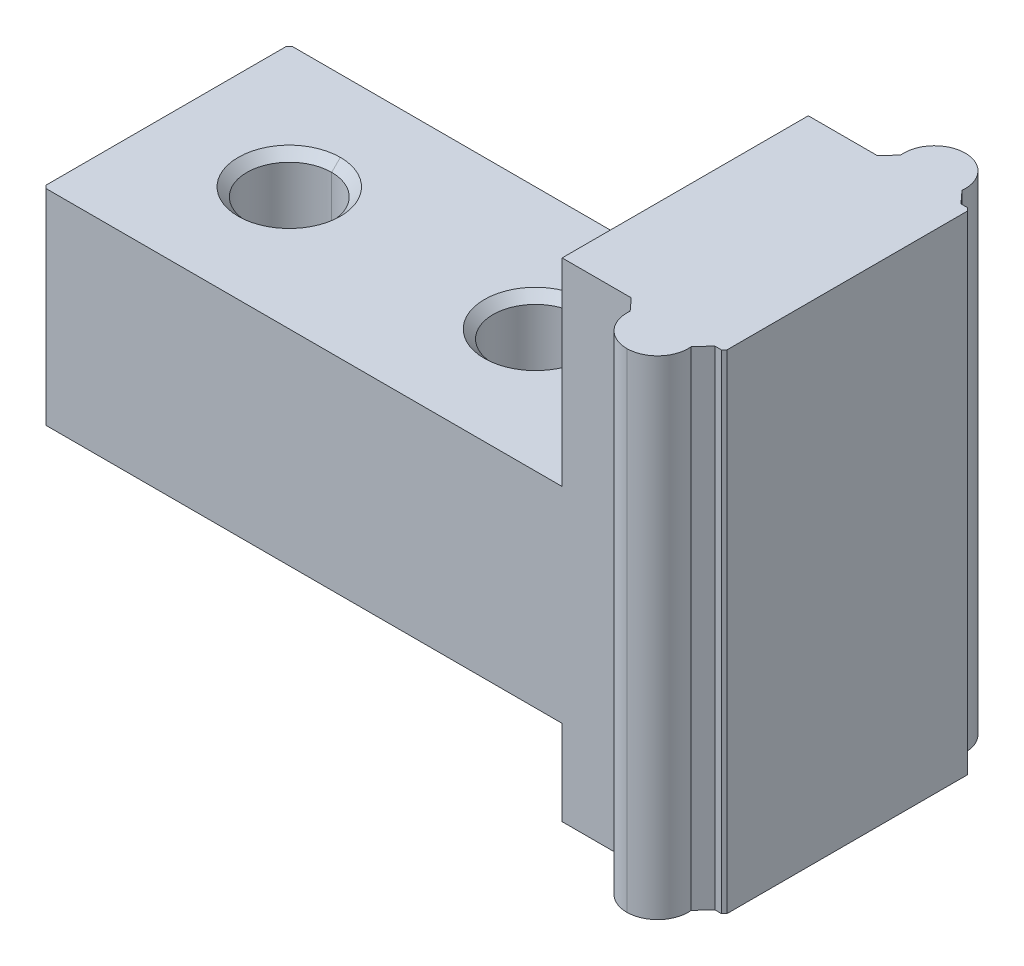
ISO-10303-21;
HEADER;
FILE_DESCRIPTION(('STEP AP214'),'2;1');
FILE_NAME('part.step','',(''),(''),'','','');
FILE_SCHEMA(('AUTOMOTIVE_DESIGN { 1 0 10303 214 1 1 1 1 }'));
ENDSEC;
DATA;
#1=APPLICATION_CONTEXT('core data for automotive mechanical design processes');
#2=APPLICATION_PROTOCOL_DEFINITION('international standard','automotive_design',2000,#1);
#3=PRODUCT_CONTEXT('',#1,'mechanical');
#4=PRODUCT('Part','Part','',(#3));
#5=PRODUCT_RELATED_PRODUCT_CATEGORY('part','',(#4));
#6=PRODUCT_DEFINITION_FORMATION('','',#4);
#7=PRODUCT_DEFINITION_CONTEXT('part definition',#1,'design');
#8=PRODUCT_DEFINITION('design','',#6,#7);
#9=PRODUCT_DEFINITION_SHAPE('','',#8);
#10=(LENGTH_UNIT() NAMED_UNIT(*) SI_UNIT(.MILLI.,.METRE.));
#11=(NAMED_UNIT(*) PLANE_ANGLE_UNIT() SI_UNIT($,.RADIAN.));
#12=(NAMED_UNIT(*) SI_UNIT($,.STERADIAN.) SOLID_ANGLE_UNIT());
#13=UNCERTAINTY_MEASURE_WITH_UNIT(LENGTH_MEASURE(1.E-05),#10,'distance_accuracy_value','');
#14=(GEOMETRIC_REPRESENTATION_CONTEXT(3) GLOBAL_UNCERTAINTY_ASSIGNED_CONTEXT((#13)) GLOBAL_UNIT_ASSIGNED_CONTEXT((#10,
#11,#12)) REPRESENTATION_CONTEXT('',''));
#15=CARTESIAN_POINT('',(0.,0.,0.));
#16=DIRECTION('',(0.,0.,1.));
#17=DIRECTION('',(1.,0.,0.));
#18=AXIS2_PLACEMENT_3D('',#15,#16,#17);
#19=CARTESIAN_POINT('',(-85.,-17.073,0.));
#20=DIRECTION('',(0.,1.,0.));
#21=DIRECTION('',(0.,0.,1.));
#22=AXIS2_PLACEMENT_3D('',#19,#20,#21);
#23=CONICAL_SURFACE('',#22,2.067,0.785398163397469);
#24=DIRECTION('',(0.,0.707106781186533,-0.707106781186562));
#25=VECTOR('',#24,1.);
#26=CARTESIAN_POINT('',(-85.,-17.073,-2.067));
#27=LINE('',#26,#25);
#28=CARTESIAN_POINT('',(-85.,-17.073,-2.067));
#29=VERTEX_POINT('',#28);
#30=CARTESIAN_POINT('',(-85.,-16.65,-2.49));
#31=VERTEX_POINT('',#30);
#32=EDGE_CURVE('E477',#29,#31,#27,.T.);
#33=ORIENTED_EDGE('',*,*,#32,.F.);
#34=CARTESIAN_POINT('',(-85.,-17.073,0.));
#35=DIRECTION('',(0.,1.,0.));
#36=DIRECTION('',(0.,0.,1.));
#37=AXIS2_PLACEMENT_3D('',#34,#35,#36);
#38=CIRCLE('',#37,2.067);
#39=CARTESIAN_POINT('',(-85.,-17.073,2.067));
#40=VERTEX_POINT('',#39);
#41=EDGE_CURVE('E11',#40,#29,#38,.T.);
#42=ORIENTED_EDGE('',*,*,#41,.F.);
#43=DIRECTION('',(0.,0.707106781186533,0.707106781186562));
#44=VECTOR('',#43,1.);
#45=CARTESIAN_POINT('',(-85.,-17.073,2.067));
#46=LINE('',#45,#44);
#47=CARTESIAN_POINT('',(-85.,-16.65,2.49));
#48=VERTEX_POINT('',#47);
#49=EDGE_CURVE('E471',#40,#48,#46,.T.);
#50=ORIENTED_EDGE('',*,*,#49,.T.);
#51=CARTESIAN_POINT('',(-85.,-16.65,0.));
#52=DIRECTION('',(0.,-1.,0.));
#53=DIRECTION('',(0.,0.,1.));
#54=AXIS2_PLACEMENT_3D('',#51,#52,#53);
#55=CIRCLE('',#54,2.49);
#56=EDGE_CURVE('E352',#31,#48,#55,.T.);
#57=ORIENTED_EDGE('',*,*,#56,.F.);
#58=EDGE_LOOP('',(#33,#42,#50,#57));
#59=FACE_BOUND('',#58,.T.);
#60=ADVANCED_FACE('F17',(#59),#23,.F.);
#61=CARTESIAN_POINT('',(-85.,-16.64,0.));
#62=DIRECTION('',(0.,1.,0.));
#63=DIRECTION('',(0.,0.,1.));
#64=AXIS2_PLACEMENT_3D('',#61,#62,#63);
#65=CYLINDRICAL_SURFACE('',#64,2.067);
#66=DIRECTION('',(0.,1.,0.));
#67=VECTOR('',#66,1.);
#68=CARTESIAN_POINT('',(-85.,-16.64,-2.067));
#69=LINE('',#68,#67);
#70=CARTESIAN_POINT('',(-85.,-26.217,-2.067));
#71=VERTEX_POINT('',#70);
#72=EDGE_CURVE('E485',#71,#29,#69,.T.);
#73=ORIENTED_EDGE('',*,*,#72,.F.);
#74=CARTESIAN_POINT('',(-85.,-26.217,0.));
#75=DIRECTION('',(0.,1.,0.));
#76=DIRECTION('',(0.,0.,1.));
#77=AXIS2_PLACEMENT_3D('',#74,#75,#76);
#78=CIRCLE('',#77,2.067);
#79=CARTESIAN_POINT('',(-85.,-26.217,2.067));
#80=VERTEX_POINT('',#79);
#81=EDGE_CURVE('E27',#80,#71,#78,.T.);
#82=ORIENTED_EDGE('',*,*,#81,.F.);
#83=DIRECTION('',(0.,1.,0.));
#84=VECTOR('',#83,1.);
#85=CARTESIAN_POINT('',(-85.,-16.64,2.067));
#86=LINE('',#85,#84);
#87=EDGE_CURVE('E495',#80,#40,#86,.T.);
#88=ORIENTED_EDGE('',*,*,#87,.T.);
#89=ORIENTED_EDGE('',*,*,#41,.T.);
#90=EDGE_LOOP('',(#73,#82,#88,#89));
#91=FACE_BOUND('',#90,.T.);
#92=ADVANCED_FACE('F19',(#91),#65,.F.);
#93=CARTESIAN_POINT('',(-85.,-26.65,0.));
#94=DIRECTION('',(0.,-1.,0.));
#95=DIRECTION('',(0.,0.,-1.));
#96=AXIS2_PLACEMENT_3D('',#93,#94,#95);
#97=CONICAL_SURFACE('',#96,2.5,0.785398163397469);
#98=DIRECTION('',(0.,-0.707106781186533,0.707106781186562));
#99=VECTOR('',#98,1.);
#100=CARTESIAN_POINT('',(-85.,-26.65,2.5));
#101=LINE('',#100,#99);
#102=CARTESIAN_POINT('',(-85.,-26.65,2.5));
#103=VERTEX_POINT('',#102);
#104=EDGE_CURVE('E499',#80,#103,#101,.T.);
#105=ORIENTED_EDGE('',*,*,#104,.F.);
#106=ORIENTED_EDGE('',*,*,#81,.T.);
#107=DIRECTION('',(0.,-0.707106781186533,-0.707106781186562));
#108=VECTOR('',#107,1.);
#109=CARTESIAN_POINT('',(-85.,-26.65,-2.5));
#110=LINE('',#109,#108);
#111=CARTESIAN_POINT('',(-85.,-26.65,-2.5));
#112=VERTEX_POINT('',#111);
#113=EDGE_CURVE('E466',#71,#112,#110,.T.);
#114=ORIENTED_EDGE('',*,*,#113,.T.);
#115=CARTESIAN_POINT('',(-85.,-26.65,0.));
#116=DIRECTION('',(0.,1.,0.));
#117=DIRECTION('',(0.,0.,1.));
#118=AXIS2_PLACEMENT_3D('',#115,#116,#117);
#119=CIRCLE('',#118,2.5);
#120=EDGE_CURVE('E353',#103,#112,#119,.T.);
#121=ORIENTED_EDGE('',*,*,#120,.F.);
#122=EDGE_LOOP('',(#105,#106,#114,#121));
#123=FACE_BOUND('',#122,.T.);
#124=ADVANCED_FACE('F962',(#123),#97,.F.);
#125=CARTESIAN_POINT('',(-97.,-17.073,0.));
#126=DIRECTION('',(0.,1.,0.));
#127=DIRECTION('',(0.,0.,1.));
#128=AXIS2_PLACEMENT_3D('',#125,#126,#127);
#129=CONICAL_SURFACE('',#128,2.067,0.785398163397469);
#130=DIRECTION('',(0.,0.707106781186533,-0.707106781186562));
#131=VECTOR('',#130,1.);
#132=CARTESIAN_POINT('',(-97.,-17.073,-2.067));
#133=LINE('',#132,#131);
#134=CARTESIAN_POINT('',(-97.,-17.073,-2.067));
#135=VERTEX_POINT('',#134);
#136=CARTESIAN_POINT('',(-97.,-16.65,-2.49));
#137=VERTEX_POINT('',#136);
#138=EDGE_CURVE('E520',#135,#137,#133,.T.);
#139=ORIENTED_EDGE('',*,*,#138,.F.);
#140=CARTESIAN_POINT('',(-97.,-17.073,0.));
#141=DIRECTION('',(0.,1.,0.));
#142=DIRECTION('',(0.,0.,1.));
#143=AXIS2_PLACEMENT_3D('',#140,#141,#142);
#144=CIRCLE('',#143,2.067);
#145=CARTESIAN_POINT('',(-97.,-17.073,2.067));
#146=VERTEX_POINT('',#145);
#147=EDGE_CURVE('E452',#146,#135,#144,.T.);
#148=ORIENTED_EDGE('',*,*,#147,.F.);
#149=DIRECTION('',(0.,0.707106781186533,0.707106781186562));
#150=VECTOR('',#149,1.);
#151=CARTESIAN_POINT('',(-97.,-17.073,2.067));
#152=LINE('',#151,#150);
#153=CARTESIAN_POINT('',(-97.,-16.65,2.49));
#154=VERTEX_POINT('',#153);
#155=EDGE_CURVE('E505',#146,#154,#152,.T.);
#156=ORIENTED_EDGE('',*,*,#155,.T.);
#157=CARTESIAN_POINT('',(-97.,-16.65,0.));
#158=DIRECTION('',(0.,-1.,0.));
#159=DIRECTION('',(0.,0.,1.));
#160=AXIS2_PLACEMENT_3D('',#157,#158,#159);
#161=CIRCLE('',#160,2.49);
#162=EDGE_CURVE('E432',#137,#154,#161,.T.);
#163=ORIENTED_EDGE('',*,*,#162,.F.);
#164=EDGE_LOOP('',(#139,#148,#156,#163));
#165=FACE_BOUND('',#164,.T.);
#166=ADVANCED_FACE('F540',(#165),#129,.F.);
#167=CARTESIAN_POINT('',(-97.,-16.64,0.));
#168=DIRECTION('',(0.,1.,0.));
#169=DIRECTION('',(0.,0.,1.));
#170=AXIS2_PLACEMENT_3D('',#167,#168,#169);
#171=CYLINDRICAL_SURFACE('',#170,2.067);
#172=DIRECTION('',(0.,1.,0.));
#173=VECTOR('',#172,1.);
#174=CARTESIAN_POINT('',(-97.,-16.64,-2.067));
#175=LINE('',#174,#173);
#176=CARTESIAN_POINT('',(-97.,-26.217,-2.067));
#177=VERTEX_POINT('',#176);
#178=EDGE_CURVE('E504',#177,#135,#175,.T.);
#179=ORIENTED_EDGE('',*,*,#178,.F.);
#180=CARTESIAN_POINT('',(-97.,-26.217,0.));
#181=DIRECTION('',(0.,1.,0.));
#182=DIRECTION('',(0.,0.,1.));
#183=AXIS2_PLACEMENT_3D('',#180,#181,#182);
#184=CIRCLE('',#183,2.067);
#185=CARTESIAN_POINT('',(-97.,-26.217,2.067));
#186=VERTEX_POINT('',#185);
#187=EDGE_CURVE('E442',#186,#177,#184,.T.);
#188=ORIENTED_EDGE('',*,*,#187,.F.);
#189=DIRECTION('',(0.,1.,0.));
#190=VECTOR('',#189,1.);
#191=CARTESIAN_POINT('',(-97.,-16.64,2.067));
#192=LINE('',#191,#190);
#193=EDGE_CURVE('E207',#186,#146,#192,.T.);
#194=ORIENTED_EDGE('',*,*,#193,.T.);
#195=ORIENTED_EDGE('',*,*,#147,.T.);
#196=EDGE_LOOP('',(#179,#188,#194,#195));
#197=FACE_BOUND('',#196,.T.);
#198=ADVANCED_FACE('F690',(#197),#171,.F.);
#199=CARTESIAN_POINT('',(-97.,-26.65,0.));
#200=DIRECTION('',(0.,-1.,0.));
#201=DIRECTION('',(0.,0.,-1.));
#202=AXIS2_PLACEMENT_3D('',#199,#200,#201);
#203=CONICAL_SURFACE('',#202,2.5,0.785398163397469);
#204=DIRECTION('',(0.,-0.707106781186533,0.707106781186562));
#205=VECTOR('',#204,1.);
#206=CARTESIAN_POINT('',(-97.,-26.65,2.5));
#207=LINE('',#206,#205);
#208=CARTESIAN_POINT('',(-97.,-26.65,2.5));
#209=VERTEX_POINT('',#208);
#210=EDGE_CURVE('E210',#186,#209,#207,.T.);
#211=ORIENTED_EDGE('',*,*,#210,.F.);
#212=ORIENTED_EDGE('',*,*,#187,.T.);
#213=DIRECTION('',(0.,-0.707106781186533,-0.707106781186562));
#214=VECTOR('',#213,1.);
#215=CARTESIAN_POINT('',(-97.,-26.65,-2.5));
#216=LINE('',#215,#214);
#217=CARTESIAN_POINT('',(-97.,-26.65,-2.5));
#218=VERTEX_POINT('',#217);
#219=EDGE_CURVE('E218',#177,#218,#216,.T.);
#220=ORIENTED_EDGE('',*,*,#219,.T.);
#221=CARTESIAN_POINT('',(-97.,-26.65,0.));
#222=DIRECTION('',(0.,1.,0.));
#223=DIRECTION('',(0.,0.,1.));
#224=AXIS2_PLACEMENT_3D('',#221,#222,#223);
#225=CIRCLE('',#224,2.5);
#226=EDGE_CURVE('E348',#209,#218,#225,.T.);
#227=ORIENTED_EDGE('',*,*,#226,.F.);
#228=EDGE_LOOP('',(#211,#212,#220,#227));
#229=FACE_BOUND('',#228,.T.);
#230=ADVANCED_FACE('F975',(#229),#203,.F.);
#231=CARTESIAN_POINT('',(0.,-16.65,0.));
#232=DIRECTION('',(0.,1.,0.));
#233=DIRECTION('',(1.,0.,0.));
#234=AXIS2_PLACEMENT_3D('',#231,#232,#233);
#235=PLANE('',#234);
#236=CARTESIAN_POINT('',(-97.,-16.65,0.));
#237=DIRECTION('',(0.,-1.,0.));
#238=DIRECTION('',(0.,0.,1.));
#239=AXIS2_PLACEMENT_3D('',#236,#237,#238);
#240=CIRCLE('',#239,2.49);
#241=EDGE_CURVE('E524',#154,#137,#240,.T.);
#242=ORIENTED_EDGE('',*,*,#241,.T.);
#243=ORIENTED_EDGE('',*,*,#162,.T.);
#244=EDGE_LOOP('',(#242,#243));
#245=FACE_BOUND('',#244,.T.);
#246=CARTESIAN_POINT('',(-85.,-16.65,0.));
#247=DIRECTION('',(0.,-1.,0.));
#248=DIRECTION('',(0.,0.,1.));
#249=AXIS2_PLACEMENT_3D('',#246,#247,#248);
#250=CIRCLE('',#249,2.49);
#251=EDGE_CURVE('E476',#48,#31,#250,.T.);
#252=ORIENTED_EDGE('',*,*,#251,.T.);
#253=ORIENTED_EDGE('',*,*,#56,.T.);
#254=EDGE_LOOP('',(#252,#253));
#255=FACE_BOUND('',#254,.T.);
#256=DIRECTION('',(1.,0.,0.));
#257=VECTOR('',#256,1.);
#258=CARTESIAN_POINT('',(-102.85857864376,-16.65,6.));
#259=LINE('',#258,#257);
#260=CARTESIAN_POINT('',(-102.85857864376,-16.65,6.));
#261=VERTEX_POINT('',#260);
#262=CARTESIAN_POINT('',(-77.7,-16.65,6.));
#263=VERTEX_POINT('',#262);
#264=EDGE_CURVE('E328',#261,#263,#259,.T.);
#265=ORIENTED_EDGE('',*,*,#264,.T.);
#266=DIRECTION('',(0.,0.,-1.));
#267=VECTOR('',#266,1.);
#268=CARTESIAN_POINT('',(-77.7,-16.65,6.));
#269=LINE('',#268,#267);
#270=CARTESIAN_POINT('',(-77.7,-16.65,-6.));
#271=VERTEX_POINT('',#270);
#272=EDGE_CURVE('E312',#263,#271,#269,.T.);
#273=ORIENTED_EDGE('',*,*,#272,.T.);
#274=DIRECTION('',(-1.,0.,0.));
#275=VECTOR('',#274,1.);
#276=CARTESIAN_POINT('',(-77.7,-16.65,-6.));
#277=LINE('',#276,#275);
#278=CARTESIAN_POINT('',(-102.85857864376,-16.65,-6.));
#279=VERTEX_POINT('',#278);
#280=EDGE_CURVE('E231',#271,#279,#277,.T.);
#281=ORIENTED_EDGE('',*,*,#280,.T.);
#282=DIRECTION('',(-0.707106781193316,0.,0.70710678117978));
#283=VECTOR('',#282,1.);
#284=CARTESIAN_POINT('',(-102.85857864376,-16.65,-6.));
#285=LINE('',#284,#283);
#286=CARTESIAN_POINT('',(-103.,-16.65,-5.8585786437627));
#287=VERTEX_POINT('',#286);
#288=EDGE_CURVE('E198',#279,#287,#285,.T.);
#289=ORIENTED_EDGE('',*,*,#288,.T.);
#290=DIRECTION('',(0.,0.,1.));
#291=VECTOR('',#290,1.);
#292=CARTESIAN_POINT('',(-103.,-16.65,-5.8585786437627));
#293=LINE('',#292,#291);
#294=CARTESIAN_POINT('',(-103.,-16.65,5.8585786437627));
#295=VERTEX_POINT('',#294);
#296=EDGE_CURVE('E172',#287,#295,#293,.T.);
#297=ORIENTED_EDGE('',*,*,#296,.T.);
#298=DIRECTION('',(0.707106781193316,0.,0.70710678117978));
#299=VECTOR('',#298,1.);
#300=CARTESIAN_POINT('',(-103.,-16.65,5.8585786437627));
#301=LINE('',#300,#299);
#302=EDGE_CURVE('E356',#295,#261,#301,.T.);
#303=ORIENTED_EDGE('',*,*,#302,.T.);
#304=EDGE_LOOP('',(#265,#273,#281,#289,#297,#303));
#305=FACE_BOUND('',#304,.T.);
#306=ADVANCED_FACE('F549',(#245,#255,#305),#235,.T.);
#307=CARTESIAN_POINT('',(0.,-26.65,0.));
#308=DIRECTION('',(0.,1.,0.));
#309=DIRECTION('',(1.,0.,0.));
#310=AXIS2_PLACEMENT_3D('',#307,#308,#309);
#311=PLANE('',#310);
#312=CARTESIAN_POINT('',(-97.,-26.65,0.));
#313=DIRECTION('',(0.,1.,0.));
#314=DIRECTION('',(0.,0.,1.));
#315=AXIS2_PLACEMENT_3D('',#312,#313,#314);
#316=CIRCLE('',#315,2.5);
#317=EDGE_CURVE('E214',#218,#209,#316,.T.);
#318=ORIENTED_EDGE('',*,*,#317,.T.);
#319=ORIENTED_EDGE('',*,*,#226,.T.);
#320=EDGE_LOOP('',(#318,#319));
#321=FACE_BOUND('',#320,.T.);
#322=CARTESIAN_POINT('',(-85.,-26.65,0.));
#323=DIRECTION('',(0.,1.,0.));
#324=DIRECTION('',(0.,0.,1.));
#325=AXIS2_PLACEMENT_3D('',#322,#323,#324);
#326=CIRCLE('',#325,2.5);
#327=EDGE_CURVE('E512',#112,#103,#326,.T.);
#328=ORIENTED_EDGE('',*,*,#327,.T.);
#329=ORIENTED_EDGE('',*,*,#120,.T.);
#330=EDGE_LOOP('',(#328,#329));
#331=FACE_BOUND('',#330,.T.);
#332=DIRECTION('',(0.,0.,-1.));
#333=VECTOR('',#332,1.);
#334=CARTESIAN_POINT('',(-77.7,-26.65,6.));
#335=LINE('',#334,#333);
#336=CARTESIAN_POINT('',(-77.7,-26.65,6.));
#337=VERTEX_POINT('',#336);
#338=CARTESIAN_POINT('',(-77.7,-26.65,-6.));
#339=VERTEX_POINT('',#338);
#340=EDGE_CURVE('E266',#337,#339,#335,.T.);
#341=ORIENTED_EDGE('',*,*,#340,.F.);
#342=DIRECTION('',(1.,0.,0.));
#343=VECTOR('',#342,1.);
#344=CARTESIAN_POINT('',(-102.85857864376,-26.65,6.));
#345=LINE('',#344,#343);
#346=CARTESIAN_POINT('',(-102.85857864376,-26.65,6.));
#347=VERTEX_POINT('',#346);
#348=EDGE_CURVE('E336',#347,#337,#345,.T.);
#349=ORIENTED_EDGE('',*,*,#348,.F.);
#350=DIRECTION('',(0.707106781193316,0.,0.70710678117978));
#351=VECTOR('',#350,1.);
#352=CARTESIAN_POINT('',(-103.,-26.65,5.8585786437627));
#353=LINE('',#352,#351);
#354=CARTESIAN_POINT('',(-103.,-26.65,5.8585786437627));
#355=VERTEX_POINT('',#354);
#356=EDGE_CURVE('E41',#355,#347,#353,.T.);
#357=ORIENTED_EDGE('',*,*,#356,.F.);
#358=DIRECTION('',(0.,0.,1.));
#359=VECTOR('',#358,1.);
#360=CARTESIAN_POINT('',(-103.,-26.65,-5.8585786437627));
#361=LINE('',#360,#359);
#362=CARTESIAN_POINT('',(-103.,-26.65,-5.8585786437627));
#363=VERTEX_POINT('',#362);
#364=EDGE_CURVE('E178',#363,#355,#361,.T.);
#365=ORIENTED_EDGE('',*,*,#364,.F.);
#366=DIRECTION('',(-0.707106781193316,0.,0.70710678117978));
#367=VECTOR('',#366,1.);
#368=CARTESIAN_POINT('',(-102.85857864376,-26.65,-6.));
#369=LINE('',#368,#367);
#370=CARTESIAN_POINT('',(-102.85857864376,-26.65,-6.));
#371=VERTEX_POINT('',#370);
#372=EDGE_CURVE('E182',#371,#363,#369,.T.);
#373=ORIENTED_EDGE('',*,*,#372,.F.);
#374=DIRECTION('',(-1.,0.,0.));
#375=VECTOR('',#374,1.);
#376=CARTESIAN_POINT('',(-77.7,-26.65,-6.));
#377=LINE('',#376,#375);
#378=EDGE_CURVE('E232',#339,#371,#377,.T.);
#379=ORIENTED_EDGE('',*,*,#378,.F.);
#380=EDGE_LOOP('',(#341,#349,#357,#365,#373,#379));
#381=FACE_BOUND('',#380,.T.);
#382=ADVANCED_FACE('F180',(#321,#331,#381),#311,.F.);
#383=CARTESIAN_POINT('',(-103.,-26.65,5.8585786437627));
#384=DIRECTION('',(-0.707106781179767,0.,0.707106781193328));
#385=DIRECTION('',(0.,1.,0.));
#386=AXIS2_PLACEMENT_3D('',#383,#384,#385);
#387=PLANE('',#386);
#388=ORIENTED_EDGE('',*,*,#302,.F.);
#389=DIRECTION('',(0.,1.,0.));
#390=VECTOR('',#389,1.);
#391=CARTESIAN_POINT('',(-103.,-26.65,5.8585786437627));
#392=LINE('',#391,#390);
#393=EDGE_CURVE('E185',#355,#295,#392,.T.);
#394=ORIENTED_EDGE('',*,*,#393,.F.);
#395=ORIENTED_EDGE('',*,*,#356,.T.);
#396=DIRECTION('',(0.,1.,0.));
#397=VECTOR('',#396,1.);
#398=CARTESIAN_POINT('',(-102.85857864376,-26.65,6.));
#399=LINE('',#398,#397);
#400=EDGE_CURVE('E332',#347,#261,#399,.T.);
#401=ORIENTED_EDGE('',*,*,#400,.T.);
#402=EDGE_LOOP('',(#388,#394,#395,#401));
#403=FACE_BOUND('',#402,.T.);
#404=ADVANCED_FACE('F1005',(#403),#387,.T.);
#405=CARTESIAN_POINT('',(-103.,-26.65,-5.8585786437627));
#406=DIRECTION('',(-1.,0.,0.));
#407=DIRECTION('',(0.,0.,1.));
#408=AXIS2_PLACEMENT_3D('',#405,#406,#407);
#409=PLANE('',#408);
#410=ORIENTED_EDGE('',*,*,#296,.F.);
#411=DIRECTION('',(0.,1.,0.));
#412=VECTOR('',#411,1.);
#413=CARTESIAN_POINT('',(-103.,-26.65,-5.8585786437627));
#414=LINE('',#413,#412);
#415=EDGE_CURVE('E187',#363,#287,#414,.T.);
#416=ORIENTED_EDGE('',*,*,#415,.F.);
#417=ORIENTED_EDGE('',*,*,#364,.T.);
#418=ORIENTED_EDGE('',*,*,#393,.T.);
#419=EDGE_LOOP('',(#410,#416,#417,#418));
#420=FACE_BOUND('',#419,.T.);
#421=ADVANCED_FACE('F188',(#420),#409,.T.);
#422=CARTESIAN_POINT('',(-102.85857864376,-26.65,-6.));
#423=DIRECTION('',(-0.707106781179767,0.,-0.707106781193328));
#424=DIRECTION('',(-0.707106781193328,0.,0.707106781179767));
#425=AXIS2_PLACEMENT_3D('',#422,#423,#424);
#426=PLANE('',#425);
#427=ORIENTED_EDGE('',*,*,#288,.F.);
#428=DIRECTION('',(0.,1.,0.));
#429=VECTOR('',#428,1.);
#430=CARTESIAN_POINT('',(-102.85857864376,-26.65,-6.));
#431=LINE('',#430,#429);
#432=EDGE_CURVE('E195',#371,#279,#431,.T.);
#433=ORIENTED_EDGE('',*,*,#432,.F.);
#434=ORIENTED_EDGE('',*,*,#372,.T.);
#435=ORIENTED_EDGE('',*,*,#415,.T.);
#436=EDGE_LOOP('',(#427,#433,#434,#435));
#437=FACE_BOUND('',#436,.T.);
#438=ADVANCED_FACE('F193',(#437),#426,.T.);
#439=CARTESIAN_POINT('',(-72.3,-7.,6.75000000000043));
#440=DIRECTION('',(0.,1.,0.));
#441=DIRECTION('',(1.,0.,0.));
#442=AXIS2_PLACEMENT_3D('',#439,#440,#441);
#443=PLANE('',#442);
#444=DIRECTION('',(-1.,0.,0.));
#445=VECTOR('',#444,1.);
#446=CARTESIAN_POINT('',(-74.33,-7.,-6.));
#447=LINE('',#446,#445);
#448=CARTESIAN_POINT('',(-74.33,-7.,-6.));
#449=VERTEX_POINT('',#448);
#450=CARTESIAN_POINT('',(-77.7,-7.,-6.));
#451=VERTEX_POINT('',#450);
#452=EDGE_CURVE('E299',#449,#451,#447,.T.);
#453=ORIENTED_EDGE('',*,*,#452,.T.);
#454=DIRECTION('',(0.,0.,1.));
#455=VECTOR('',#454,1.);
#456=CARTESIAN_POINT('',(-77.7,-7.,-6.));
#457=LINE('',#456,#455);
#458=CARTESIAN_POINT('',(-77.7,-7.,6.));
#459=VERTEX_POINT('',#458);
#460=EDGE_CURVE('E321',#451,#459,#457,.T.);
#461=ORIENTED_EDGE('',*,*,#460,.T.);
#462=DIRECTION('',(1.,0.,0.));
#463=VECTOR('',#462,1.);
#464=CARTESIAN_POINT('',(-77.7,-7.,6.));
#465=LINE('',#464,#463);
#466=CARTESIAN_POINT('',(-74.33,-7.,6.));
#467=VERTEX_POINT('',#466);
#468=EDGE_CURVE('E347',#459,#467,#465,.T.);
#469=ORIENTED_EDGE('',*,*,#468,.T.);
#470=DIRECTION('',(0.671737143893339,0.,0.740789585181933));
#471=VECTOR('',#470,1.);
#472=CARTESIAN_POINT('',(-74.33,-7.,6.));
#473=LINE('',#472,#471);
#474=CARTESIAN_POINT('',(-73.79181454356,-7.,6.5935092091475));
#475=VERTEX_POINT('',#474);
#476=EDGE_CURVE('E364',#467,#475,#473,.T.);
#477=ORIENTED_EDGE('',*,*,#476,.T.);
#478=CARTESIAN_POINT('',(-72.3,-7.,6.75000000000043));
#479=DIRECTION('',(0.,1.,0.));
#480=DIRECTION('',(-0.994543029040242,0.,-0.104327193901979));
#481=AXIS2_PLACEMENT_3D('',#478,#479,#480);
#482=CIRCLE('',#481,1.49999999999959);
#483=CARTESIAN_POINT('',(-72.3,-7.,8.25));
#484=VERTEX_POINT('',#483);
#485=EDGE_CURVE('E245',#475,#484,#482,.T.);
#486=ORIENTED_EDGE('',*,*,#485,.T.);
#487=CARTESIAN_POINT('',(-72.3,-7.,6.75000000000043));
#488=DIRECTION('',(0.,1.,0.));
#489=DIRECTION('',(-0.994543029040242,0.,-0.104327193901979));
#490=AXIS2_PLACEMENT_3D('',#487,#488,#489);
#491=CIRCLE('',#490,1.49999999999959);
#492=CARTESIAN_POINT('',(-70.807595149903,-7.,6.5992427003244));
#493=VERTEX_POINT('',#492);
#494=EDGE_CURVE('E386',#484,#493,#491,.T.);
#495=ORIENTED_EDGE('',*,*,#494,.T.);
#496=DIRECTION('',(0.674578687870797,0.,-0.7382029489717));
#497=VECTOR('',#496,1.);
#498=CARTESIAN_POINT('',(-70.807595149903,-7.,6.5992427003244));
#499=LINE('',#498,#497);
#500=CARTESIAN_POINT('',(-70.26,-7.,6.));
#501=VERTEX_POINT('',#500);
#502=EDGE_CURVE('E390',#493,#501,#499,.T.);
#503=ORIENTED_EDGE('',*,*,#502,.T.);
#504=DIRECTION('',(1.,0.,0.));
#505=VECTOR('',#504,1.);
#506=CARTESIAN_POINT('',(-70.26,-7.,6.));
#507=LINE('',#506,#505);
#508=CARTESIAN_POINT('',(-69.941421356237,-7.,6.));
#509=VERTEX_POINT('',#508);
#510=EDGE_CURVE('E251',#501,#509,#507,.T.);
#511=ORIENTED_EDGE('',*,*,#510,.T.);
#512=DIRECTION('',(0.707106781185801,0.,-0.707106781187294));
#513=VECTOR('',#512,1.);
#514=CARTESIAN_POINT('',(-69.941421356237,-7.,6.));
#515=LINE('',#514,#513);
#516=CARTESIAN_POINT('',(-69.8,-7.,5.8585786437627));
#517=VERTEX_POINT('',#516);
#518=EDGE_CURVE('E265',#509,#517,#515,.T.);
#519=ORIENTED_EDGE('',*,*,#518,.T.);
#520=DIRECTION('',(0.,0.,-1.));
#521=VECTOR('',#520,1.);
#522=CARTESIAN_POINT('',(-69.8,-7.,5.8585786437627));
#523=LINE('',#522,#521);
#524=CARTESIAN_POINT('',(-69.8,-7.,-5.8585786437627));
#525=VERTEX_POINT('',#524);
#526=EDGE_CURVE('E395',#517,#525,#523,.T.);
#527=ORIENTED_EDGE('',*,*,#526,.T.);
#528=DIRECTION('',(-0.707106781185801,0.,-0.707106781187294));
#529=VECTOR('',#528,1.);
#530=CARTESIAN_POINT('',(-69.8,-7.,-5.8585786437627));
#531=LINE('',#530,#529);
#532=CARTESIAN_POINT('',(-69.941421356237,-7.,-6.));
#533=VERTEX_POINT('',#532);
#534=EDGE_CURVE('E237',#525,#533,#531,.T.);
#535=ORIENTED_EDGE('',*,*,#534,.T.);
#536=DIRECTION('',(-1.,0.,0.));
#537=VECTOR('',#536,1.);
#538=CARTESIAN_POINT('',(-69.941421356237,-7.,-6.));
#539=LINE('',#538,#537);
#540=CARTESIAN_POINT('',(-70.26,-7.,-6.));
#541=VERTEX_POINT('',#540);
#542=EDGE_CURVE('E227',#533,#541,#539,.T.);
#543=ORIENTED_EDGE('',*,*,#542,.T.);
#544=DIRECTION('',(-0.674578687870797,0.,-0.7382029489717));
#545=VECTOR('',#544,1.);
#546=CARTESIAN_POINT('',(-70.26,-7.,-6.));
#547=LINE('',#546,#545);
#548=CARTESIAN_POINT('',(-70.807595149903,-7.,-6.5992427003244));
#549=VERTEX_POINT('',#548);
#550=EDGE_CURVE('E289',#541,#549,#547,.T.);
#551=ORIENTED_EDGE('',*,*,#550,.T.);
#552=CARTESIAN_POINT('',(-72.3,-7.,-6.75000000000043));
#553=DIRECTION('',(0.,1.,0.));
#554=DIRECTION('',(0.99493656673163,0.,0.100504866450717));
#555=AXIS2_PLACEMENT_3D('',#552,#553,#554);
#556=CIRCLE('',#555,1.4999999999996);
#557=CARTESIAN_POINT('',(-73.79181454356,-7.,-6.5935092091475));
#558=VERTEX_POINT('',#557);
#559=EDGE_CURVE('E316',#549,#558,#556,.T.);
#560=ORIENTED_EDGE('',*,*,#559,.T.);
#561=DIRECTION('',(-0.67173714389334,0.,0.740789585181932));
#562=VECTOR('',#561,1.);
#563=CARTESIAN_POINT('',(-73.79181454356,-7.,-6.5935092091475));
#564=LINE('',#563,#562);
#565=EDGE_CURVE('E271',#558,#449,#564,.T.);
#566=ORIENTED_EDGE('',*,*,#565,.T.);
#567=EDGE_LOOP('',(#453,#461,#469,#477,#486,#495,#503,#511,#519,#527,#535,#543,#551,#560,#566));
#568=FACE_BOUND('',#567,.T.);
#569=ADVANCED_FACE('F652',(#568),#443,.T.);
#570=CARTESIAN_POINT('',(-72.3,-30.8,6.75000000000043));
#571=DIRECTION('',(0.,1.,0.));
#572=DIRECTION('',(1.,0.,0.));
#573=AXIS2_PLACEMENT_3D('',#570,#571,#572);
#574=PLANE('',#573);
#575=DIRECTION('',(-1.,0.,0.));
#576=VECTOR('',#575,1.);
#577=CARTESIAN_POINT('',(-74.33,-30.8,-6.));
#578=LINE('',#577,#576);
#579=CARTESIAN_POINT('',(-74.33,-30.8,-6.));
#580=VERTEX_POINT('',#579);
#581=CARTESIAN_POINT('',(-77.7,-30.8,-6.));
#582=VERTEX_POINT('',#581);
#583=EDGE_CURVE('E309',#580,#582,#578,.T.);
#584=ORIENTED_EDGE('',*,*,#583,.F.);
#585=DIRECTION('',(-0.67173714389334,0.,0.740789585181932));
#586=VECTOR('',#585,1.);
#587=CARTESIAN_POINT('',(-73.79181454356,-30.8,-6.5935092091475));
#588=LINE('',#587,#586);
#589=CARTESIAN_POINT('',(-73.79181454356,-30.8,-6.5935092091475));
#590=VERTEX_POINT('',#589);
#591=EDGE_CURVE('E204',#590,#580,#588,.T.);
#592=ORIENTED_EDGE('',*,*,#591,.F.);
#593=CARTESIAN_POINT('',(-72.3,-30.8,-6.75000000000043));
#594=DIRECTION('',(0.,1.,0.));
#595=DIRECTION('',(0.99493656673163,0.,0.100504866450717));
#596=AXIS2_PLACEMENT_3D('',#593,#594,#595);
#597=CIRCLE('',#596,1.4999999999996);
#598=CARTESIAN_POINT('',(-70.807595149903,-30.8,-6.5992427003244));
#599=VERTEX_POINT('',#598);
#600=EDGE_CURVE('E357',#599,#590,#597,.T.);
#601=ORIENTED_EDGE('',*,*,#600,.F.);
#602=DIRECTION('',(-0.674578687870797,0.,-0.7382029489717));
#603=VECTOR('',#602,1.);
#604=CARTESIAN_POINT('',(-70.26,-30.8,-6.));
#605=LINE('',#604,#603);
#606=CARTESIAN_POINT('',(-70.26,-30.8,-6.));
#607=VERTEX_POINT('',#606);
#608=EDGE_CURVE('E284',#607,#599,#605,.T.);
#609=ORIENTED_EDGE('',*,*,#608,.F.);
#610=DIRECTION('',(-1.,0.,0.));
#611=VECTOR('',#610,1.);
#612=CARTESIAN_POINT('',(-69.941421356237,-30.8,-6.));
#613=LINE('',#612,#611);
#614=CARTESIAN_POINT('',(-69.941421356237,-30.8,-6.));
#615=VERTEX_POINT('',#614);
#616=EDGE_CURVE('E424',#615,#607,#613,.T.);
#617=ORIENTED_EDGE('',*,*,#616,.F.);
#618=DIRECTION('',(-0.707106781185801,0.,-0.707106781187294));
#619=VECTOR('',#618,1.);
#620=CARTESIAN_POINT('',(-69.8,-30.8,-5.8585786437627));
#621=LINE('',#620,#619);
#622=CARTESIAN_POINT('',(-69.8,-30.8,-5.8585786437627));
#623=VERTEX_POINT('',#622);
#624=EDGE_CURVE('E228',#623,#615,#621,.T.);
#625=ORIENTED_EDGE('',*,*,#624,.F.);
#626=DIRECTION('',(0.,0.,-1.));
#627=VECTOR('',#626,1.);
#628=CARTESIAN_POINT('',(-69.8,-30.8,5.8585786437627));
#629=LINE('',#628,#627);
#630=CARTESIAN_POINT('',(-69.8,-30.8,5.8585786437627));
#631=VERTEX_POINT('',#630);
#632=EDGE_CURVE('E327',#631,#623,#629,.T.);
#633=ORIENTED_EDGE('',*,*,#632,.F.);
#634=DIRECTION('',(0.707106781185801,0.,-0.707106781187294));
#635=VECTOR('',#634,1.);
#636=CARTESIAN_POINT('',(-69.941421356237,-30.8,6.));
#637=LINE('',#636,#635);
#638=CARTESIAN_POINT('',(-69.941421356237,-30.8,6.));
#639=VERTEX_POINT('',#638);
#640=EDGE_CURVE('E260',#639,#631,#637,.T.);
#641=ORIENTED_EDGE('',*,*,#640,.F.);
#642=DIRECTION('',(1.,0.,0.));
#643=VECTOR('',#642,1.);
#644=CARTESIAN_POINT('',(-70.26,-30.8,6.));
#645=LINE('',#644,#643);
#646=CARTESIAN_POINT('',(-70.26,-30.8,6.));
#647=VERTEX_POINT('',#646);
#648=EDGE_CURVE('E246',#647,#639,#645,.T.);
#649=ORIENTED_EDGE('',*,*,#648,.F.);
#650=DIRECTION('',(0.674578687870797,0.,-0.7382029489717));
#651=VECTOR('',#650,1.);
#652=CARTESIAN_POINT('',(-70.807595149903,-30.8,6.5992427003244));
#653=LINE('',#652,#651);
#654=CARTESIAN_POINT('',(-70.807595149903,-30.8,6.5992427003244));
#655=VERTEX_POINT('',#654);
#656=EDGE_CURVE('E394',#655,#647,#653,.T.);
#657=ORIENTED_EDGE('',*,*,#656,.F.);
#658=CARTESIAN_POINT('',(-72.3,-30.8,6.75000000000043));
#659=DIRECTION('',(0.,1.,0.));
#660=DIRECTION('',(-0.994543029040242,0.,-0.104327193901979));
#661=AXIS2_PLACEMENT_3D('',#658,#659,#660);
#662=CIRCLE('',#661,1.49999999999959);
#663=CARTESIAN_POINT('',(-72.3,-30.8,8.25));
#664=VERTEX_POINT('',#663);
#665=EDGE_CURVE('E372',#664,#655,#662,.T.);
#666=ORIENTED_EDGE('',*,*,#665,.F.);
#667=CARTESIAN_POINT('',(-72.3,-30.8,6.75000000000043));
#668=DIRECTION('',(0.,1.,0.));
#669=DIRECTION('',(-0.994543029040242,0.,-0.104327193901979));
#670=AXIS2_PLACEMENT_3D('',#667,#668,#669);
#671=CIRCLE('',#670,1.49999999999959);
#672=CARTESIAN_POINT('',(-73.79181454356,-30.8,6.5935092091475));
#673=VERTEX_POINT('',#672);
#674=EDGE_CURVE('E222',#673,#664,#671,.T.);
#675=ORIENTED_EDGE('',*,*,#674,.F.);
#676=DIRECTION('',(0.671737143893339,0.,0.740789585181933));
#677=VECTOR('',#676,1.);
#678=CARTESIAN_POINT('',(-74.33,-30.8,6.));
#679=LINE('',#678,#677);
#680=CARTESIAN_POINT('',(-74.33,-30.8,6.));
#681=VERTEX_POINT('',#680);
#682=EDGE_CURVE('E368',#681,#673,#679,.T.);
#683=ORIENTED_EDGE('',*,*,#682,.F.);
#684=DIRECTION('',(1.,0.,0.));
#685=VECTOR('',#684,1.);
#686=CARTESIAN_POINT('',(-77.7,-30.8,6.));
#687=LINE('',#686,#685);
#688=CARTESIAN_POINT('',(-77.7,-30.8,6.));
#689=VERTEX_POINT('',#688);
#690=EDGE_CURVE('E339',#689,#681,#687,.T.);
#691=ORIENTED_EDGE('',*,*,#690,.F.);
#692=DIRECTION('',(0.,0.,1.));
#693=VECTOR('',#692,1.);
#694=CARTESIAN_POINT('',(-77.7,-30.8,-6.));
#695=LINE('',#694,#693);
#696=EDGE_CURVE('E278',#582,#689,#695,.T.);
#697=ORIENTED_EDGE('',*,*,#696,.F.);
#698=EDGE_LOOP('',(#584,#592,#601,#609,#617,#625,#633,#641,#649,#657,#666,#675,#683,#691,#697));
#699=FACE_BOUND('',#698,.T.);
#700=ADVANCED_FACE('F592',(#699),#574,.F.);
#701=CARTESIAN_POINT('',(-73.79181454356,-30.8,-6.5935092091475));
#702=DIRECTION('',(-0.740789585181936,0.,-0.671737143893335));
#703=DIRECTION('',(-0.671737143893335,0.,0.740789585181936));
#704=AXIS2_PLACEMENT_3D('',#701,#702,#703);
#705=PLANE('',#704);
#706=ORIENTED_EDGE('',*,*,#565,.F.);
#707=DIRECTION('',(0.,1.,0.));
#708=VECTOR('',#707,1.);
#709=CARTESIAN_POINT('',(-73.79181454356,-30.8,-6.5935092091475));
#710=LINE('',#709,#708);
#711=EDGE_CURVE('E274',#590,#558,#710,.T.);
#712=ORIENTED_EDGE('',*,*,#711,.F.);
#713=ORIENTED_EDGE('',*,*,#591,.T.);
#714=DIRECTION('',(0.,1.,0.));
#715=VECTOR('',#714,1.);
#716=CARTESIAN_POINT('',(-74.33,-30.8,-6.));
#717=LINE('',#716,#715);
#718=EDGE_CURVE('E303',#580,#449,#717,.T.);
#719=ORIENTED_EDGE('',*,*,#718,.T.);
#720=EDGE_LOOP('',(#706,#712,#713,#719));
#721=FACE_BOUND('',#720,.T.);
#722=ADVANCED_FACE('F611',(#721),#705,.T.);
#723=CARTESIAN_POINT('',(-72.3,-30.8,-6.75000000000043));
#724=DIRECTION('',(0.,1.,0.));
#725=DIRECTION('',(0.,0.,1.));
#726=AXIS2_PLACEMENT_3D('',#723,#724,#725);
#727=CYLINDRICAL_SURFACE('',#726,1.4999999999996);
#728=ORIENTED_EDGE('',*,*,#559,.F.);
#729=DIRECTION('',(0.,1.,0.));
#730=VECTOR('',#729,1.);
#731=CARTESIAN_POINT('',(-70.807595149903,-30.8,-6.5992427003244));
#732=LINE('',#731,#730);
#733=EDGE_CURVE('E288',#599,#549,#732,.T.);
#734=ORIENTED_EDGE('',*,*,#733,.F.);
#735=ORIENTED_EDGE('',*,*,#600,.T.);
#736=ORIENTED_EDGE('',*,*,#711,.T.);
#737=EDGE_LOOP('',(#728,#734,#735,#736));
#738=FACE_BOUND('',#737,.T.);
#739=ADVANCED_FACE('F614',(#738),#727,.T.);
#740=CARTESIAN_POINT('',(-70.26,-30.8,-6.));
#741=DIRECTION('',(0.738202948971699,0.,-0.674578687870798));
#742=DIRECTION('',(0.,-1.,0.));
#743=AXIS2_PLACEMENT_3D('',#740,#741,#742);
#744=PLANE('',#743);
#745=ORIENTED_EDGE('',*,*,#550,.F.);
#746=DIRECTION('',(0.,1.,0.));
#747=VECTOR('',#746,1.);
#748=CARTESIAN_POINT('',(-70.26,-30.8,-6.));
#749=LINE('',#748,#747);
#750=EDGE_CURVE('E428',#607,#541,#749,.T.);
#751=ORIENTED_EDGE('',*,*,#750,.F.);
#752=ORIENTED_EDGE('',*,*,#608,.T.);
#753=ORIENTED_EDGE('',*,*,#733,.T.);
#754=EDGE_LOOP('',(#745,#751,#752,#753));
#755=FACE_BOUND('',#754,.T.);
#756=ADVANCED_FACE('F618',(#755),#744,.T.);
#757=CARTESIAN_POINT('',(-69.941421356237,-30.8,-6.));
#758=DIRECTION('',(0.,0.,-1.));
#759=DIRECTION('',(0.,-1.,0.));
#760=AXIS2_PLACEMENT_3D('',#757,#758,#759);
#761=PLANE('',#760);
#762=ORIENTED_EDGE('',*,*,#542,.F.);
#763=DIRECTION('',(0.,1.,0.));
#764=VECTOR('',#763,1.);
#765=CARTESIAN_POINT('',(-69.941421356237,-30.8,-6.));
#766=LINE('',#765,#764);
#767=EDGE_CURVE('E223',#615,#533,#766,.T.);
#768=ORIENTED_EDGE('',*,*,#767,.F.);
#769=ORIENTED_EDGE('',*,*,#616,.T.);
#770=ORIENTED_EDGE('',*,*,#750,.T.);
#771=EDGE_LOOP('',(#762,#768,#769,#770));
#772=FACE_BOUND('',#771,.T.);
#773=ADVANCED_FACE('F622',(#772),#761,.T.);
#774=CARTESIAN_POINT('',(-69.8,-30.8,-5.8585786437627));
#775=DIRECTION('',(0.707106781187296,0.,-0.7071067811858));
#776=DIRECTION('',(0.,-1.,0.));
#777=AXIS2_PLACEMENT_3D('',#774,#775,#776);
#778=PLANE('',#777);
#779=ORIENTED_EDGE('',*,*,#534,.F.);
#780=DIRECTION('',(0.,1.,0.));
#781=VECTOR('',#780,1.);
#782=CARTESIAN_POINT('',(-69.8,-30.8,-5.8585786437627));
#783=LINE('',#782,#781);
#784=EDGE_CURVE('E241',#623,#525,#783,.T.);
#785=ORIENTED_EDGE('',*,*,#784,.F.);
#786=ORIENTED_EDGE('',*,*,#624,.T.);
#787=ORIENTED_EDGE('',*,*,#767,.T.);
#788=EDGE_LOOP('',(#779,#785,#786,#787));
#789=FACE_BOUND('',#788,.T.);
#790=ADVANCED_FACE('F624',(#789),#778,.T.);
#791=CARTESIAN_POINT('',(-69.8,-30.8,5.8585786437627));
#792=DIRECTION('',(1.,0.,0.));
#793=DIRECTION('',(0.,1.,0.));
#794=AXIS2_PLACEMENT_3D('',#791,#792,#793);
#795=PLANE('',#794);
#796=ORIENTED_EDGE('',*,*,#526,.F.);
#797=DIRECTION('',(0.,1.,0.));
#798=VECTOR('',#797,1.);
#799=CARTESIAN_POINT('',(-69.8,-30.8,5.8585786437627));
#800=LINE('',#799,#798);
#801=EDGE_CURVE('E264',#631,#517,#800,.T.);
#802=ORIENTED_EDGE('',*,*,#801,.F.);
#803=ORIENTED_EDGE('',*,*,#632,.T.);
#804=ORIENTED_EDGE('',*,*,#784,.T.);
#805=EDGE_LOOP('',(#796,#802,#803,#804));
#806=FACE_BOUND('',#805,.T.);
#807=ADVANCED_FACE('F627',(#806),#795,.T.);
#808=CARTESIAN_POINT('',(-69.941421356237,-30.8,6.));
#809=DIRECTION('',(0.707106781187296,0.,0.7071067811858));
#810=DIRECTION('',(0.,-1.,0.));
#811=AXIS2_PLACEMENT_3D('',#808,#809,#810);
#812=PLANE('',#811);
#813=ORIENTED_EDGE('',*,*,#518,.F.);
#814=DIRECTION('',(0.,1.,0.));
#815=VECTOR('',#814,1.);
#816=CARTESIAN_POINT('',(-69.941421356237,-30.8,6.));
#817=LINE('',#816,#815);
#818=EDGE_CURVE('E250',#639,#509,#817,.T.);
#819=ORIENTED_EDGE('',*,*,#818,.F.);
#820=ORIENTED_EDGE('',*,*,#640,.T.);
#821=ORIENTED_EDGE('',*,*,#801,.T.);
#822=EDGE_LOOP('',(#813,#819,#820,#821));
#823=FACE_BOUND('',#822,.T.);
#824=ADVANCED_FACE('F631',(#823),#812,.T.);
#825=CARTESIAN_POINT('',(-70.26,-30.8,6.));
#826=DIRECTION('',(0.,0.,1.));
#827=DIRECTION('',(1.,0.,0.));
#828=AXIS2_PLACEMENT_3D('',#825,#826,#827);
#829=PLANE('',#828);
#830=ORIENTED_EDGE('',*,*,#510,.F.);
#831=DIRECTION('',(0.,1.,0.));
#832=VECTOR('',#831,1.);
#833=CARTESIAN_POINT('',(-70.26,-30.8,6.));
#834=LINE('',#833,#832);
#835=EDGE_CURVE('E399',#647,#501,#834,.T.);
#836=ORIENTED_EDGE('',*,*,#835,.F.);
#837=ORIENTED_EDGE('',*,*,#648,.T.);
#838=ORIENTED_EDGE('',*,*,#818,.T.);
#839=EDGE_LOOP('',(#830,#836,#837,#838));
#840=FACE_BOUND('',#839,.T.);
#841=ADVANCED_FACE('F633',(#840),#829,.T.);
#842=CARTESIAN_POINT('',(-70.807595149903,-30.8,6.5992427003244));
#843=DIRECTION('',(0.738202948971699,0.,0.674578687870798));
#844=DIRECTION('',(0.,-1.,0.));
#845=AXIS2_PLACEMENT_3D('',#842,#843,#844);
#846=PLANE('',#845);
#847=ORIENTED_EDGE('',*,*,#502,.F.);
#848=DIRECTION('',(0.,1.,0.));
#849=VECTOR('',#848,1.);
#850=CARTESIAN_POINT('',(-70.807595149903,-30.8,6.5992427003244));
#851=LINE('',#850,#849);
#852=EDGE_CURVE('E376',#655,#493,#851,.T.);
#853=ORIENTED_EDGE('',*,*,#852,.F.);
#854=ORIENTED_EDGE('',*,*,#656,.T.);
#855=ORIENTED_EDGE('',*,*,#835,.T.);
#856=EDGE_LOOP('',(#847,#853,#854,#855));
#857=FACE_BOUND('',#856,.T.);
#858=ADVANCED_FACE('F636',(#857),#846,.T.);
#859=CARTESIAN_POINT('',(-72.3,-30.8,6.75000000000043));
#860=DIRECTION('',(0.,1.,0.));
#861=DIRECTION('',(0.,0.,1.));
#862=AXIS2_PLACEMENT_3D('',#859,#860,#861);
#863=CYLINDRICAL_SURFACE('',#862,1.49999999999959);
#864=DIRECTION('',(0.,1.,0.));
#865=VECTOR('',#864,1.);
#866=CARTESIAN_POINT('',(-72.3,-30.8,8.25));
#867=LINE('',#866,#865);
#868=EDGE_CURVE('E236',#664,#484,#867,.T.);
#869=ORIENTED_EDGE('',*,*,#868,.F.);
#870=ORIENTED_EDGE('',*,*,#665,.T.);
#871=ORIENTED_EDGE('',*,*,#852,.T.);
#872=ORIENTED_EDGE('',*,*,#494,.F.);
#873=EDGE_LOOP('',(#869,#870,#871,#872));
#874=FACE_BOUND('',#873,.T.);
#875=ADVANCED_FACE('F639',(#874),#863,.T.);
#876=CARTESIAN_POINT('',(-74.33,-30.8,6.));
#877=DIRECTION('',(-0.740789585181936,0.,0.671737143893335));
#878=DIRECTION('',(0.,1.,0.));
#879=AXIS2_PLACEMENT_3D('',#876,#877,#878);
#880=PLANE('',#879);
#881=ORIENTED_EDGE('',*,*,#476,.F.);
#882=DIRECTION('',(0.,1.,0.));
#883=VECTOR('',#882,1.);
#884=CARTESIAN_POINT('',(-74.33,-30.8,6.));
#885=LINE('',#884,#883);
#886=EDGE_CURVE('E343',#681,#467,#885,.T.);
#887=ORIENTED_EDGE('',*,*,#886,.F.);
#888=ORIENTED_EDGE('',*,*,#682,.T.);
#889=DIRECTION('',(0.,1.,0.));
#890=VECTOR('',#889,1.);
#891=CARTESIAN_POINT('',(-73.79181454356,-30.8,6.5935092091475));
#892=LINE('',#891,#890);
#893=EDGE_CURVE('E255',#673,#475,#892,.T.);
#894=ORIENTED_EDGE('',*,*,#893,.T.);
#895=EDGE_LOOP('',(#881,#887,#888,#894));
#896=FACE_BOUND('',#895,.T.);
#897=ADVANCED_FACE('F645',(#896),#880,.T.);
#898=CARTESIAN_POINT('',(-77.7,-30.8,6.));
#899=DIRECTION('',(0.,0.,1.));
#900=DIRECTION('',(1.,0.,0.));
#901=AXIS2_PLACEMENT_3D('',#898,#899,#900);
#902=PLANE('',#901);
#903=DIRECTION('',(0.,1.,0.));
#904=VECTOR('',#903,1.);
#905=CARTESIAN_POINT('',(-77.7,-16.65,6.));
#906=LINE('',#905,#904);
#907=EDGE_CURVE('E317',#263,#459,#906,.T.);
#908=ORIENTED_EDGE('',*,*,#907,.F.);
#909=ORIENTED_EDGE('',*,*,#264,.F.);
#910=ORIENTED_EDGE('',*,*,#400,.F.);
#911=ORIENTED_EDGE('',*,*,#348,.T.);
#912=DIRECTION('',(0.,1.,0.));
#913=VECTOR('',#912,1.);
#914=CARTESIAN_POINT('',(-77.7,-30.8,6.));
#915=LINE('',#914,#913);
#916=EDGE_CURVE('E259',#689,#337,#915,.T.);
#917=ORIENTED_EDGE('',*,*,#916,.F.);
#918=ORIENTED_EDGE('',*,*,#690,.T.);
#919=ORIENTED_EDGE('',*,*,#886,.T.);
#920=ORIENTED_EDGE('',*,*,#468,.F.);
#921=EDGE_LOOP('',(#908,#909,#910,#911,#917,#918,#919,#920));
#922=FACE_BOUND('',#921,.T.);
#923=ADVANCED_FACE('F601',(#922),#902,.T.);
#924=CARTESIAN_POINT('',(-77.7,-30.8,-6.));
#925=DIRECTION('',(-1.,0.,0.));
#926=DIRECTION('',(0.,0.,1.));
#927=AXIS2_PLACEMENT_3D('',#924,#925,#926);
#928=PLANE('',#927);
#929=ORIENTED_EDGE('',*,*,#272,.F.);
#930=ORIENTED_EDGE('',*,*,#907,.T.);
#931=ORIENTED_EDGE('',*,*,#460,.F.);
#932=DIRECTION('',(0.,1.,0.));
#933=VECTOR('',#932,1.);
#934=CARTESIAN_POINT('',(-77.7,-16.65,-6.));
#935=LINE('',#934,#933);
#936=EDGE_CURVE('E295',#271,#451,#935,.T.);
#937=ORIENTED_EDGE('',*,*,#936,.F.);
#938=EDGE_LOOP('',(#929,#930,#931,#937));
#939=FACE_BOUND('',#938,.T.);
#940=ADVANCED_FACE('F655',(#939),#928,.T.);
#941=CARTESIAN_POINT('',(-74.33,-30.8,-6.));
#942=DIRECTION('',(0.,0.,-1.));
#943=DIRECTION('',(0.,-1.,0.));
#944=AXIS2_PLACEMENT_3D('',#941,#942,#943);
#945=PLANE('',#944);
#946=DIRECTION('',(0.,1.,0.));
#947=VECTOR('',#946,1.);
#948=CARTESIAN_POINT('',(-77.7,-30.8,-6.));
#949=LINE('',#948,#947);
#950=EDGE_CURVE('E270',#582,#339,#949,.T.);
#951=ORIENTED_EDGE('',*,*,#950,.T.);
#952=ORIENTED_EDGE('',*,*,#378,.T.);
#953=ORIENTED_EDGE('',*,*,#432,.T.);
#954=ORIENTED_EDGE('',*,*,#280,.F.);
#955=ORIENTED_EDGE('',*,*,#936,.T.);
#956=ORIENTED_EDGE('',*,*,#452,.F.);
#957=ORIENTED_EDGE('',*,*,#718,.F.);
#958=ORIENTED_EDGE('',*,*,#583,.T.);
#959=EDGE_LOOP('',(#951,#952,#953,#954,#955,#956,#957,#958));
#960=FACE_BOUND('',#959,.T.);
#961=ADVANCED_FACE('F605',(#960),#945,.T.);
#962=CARTESIAN_POINT('',(-77.7,-30.8,-6.));
#963=DIRECTION('',(-1.,0.,0.));
#964=DIRECTION('',(0.,0.,1.));
#965=AXIS2_PLACEMENT_3D('',#962,#963,#964);
#966=PLANE('',#965);
#967=ORIENTED_EDGE('',*,*,#916,.T.);
#968=ORIENTED_EDGE('',*,*,#340,.T.);
#969=ORIENTED_EDGE('',*,*,#950,.F.);
#970=ORIENTED_EDGE('',*,*,#696,.T.);
#971=EDGE_LOOP('',(#967,#968,#969,#970));
#972=FACE_BOUND('',#971,.T.);
#973=ADVANCED_FACE('F599',(#972),#966,.T.);
#974=CARTESIAN_POINT('',(-72.3,-30.8,6.75000000000043));
#975=DIRECTION('',(0.,1.,0.));
#976=DIRECTION('',(0.,0.,1.));
#977=AXIS2_PLACEMENT_3D('',#974,#975,#976);
#978=CYLINDRICAL_SURFACE('',#977,1.49999999999959);
#979=ORIENTED_EDGE('',*,*,#674,.T.);
#980=ORIENTED_EDGE('',*,*,#868,.T.);
#981=ORIENTED_EDGE('',*,*,#485,.F.);
#982=ORIENTED_EDGE('',*,*,#893,.F.);
#983=EDGE_LOOP('',(#979,#980,#981,#982));
#984=FACE_BOUND('',#983,.T.);
#985=ADVANCED_FACE('F643',(#984),#978,.T.);
#986=CARTESIAN_POINT('',(-97.,-26.65,0.));
#987=DIRECTION('',(0.,-1.,0.));
#988=DIRECTION('',(0.,0.,-1.));
#989=AXIS2_PLACEMENT_3D('',#986,#987,#988);
#990=CONICAL_SURFACE('',#989,2.5,0.785398163397469);
#991=CARTESIAN_POINT('',(-97.,-26.217,0.));
#992=DIRECTION('',(0.,1.,0.));
#993=DIRECTION('',(0.,0.,1.));
#994=AXIS2_PLACEMENT_3D('',#991,#992,#993);
#995=CIRCLE('',#994,2.067);
#996=EDGE_CURVE('E500',#177,#186,#995,.T.);
#997=ORIENTED_EDGE('',*,*,#996,.T.);
#998=ORIENTED_EDGE('',*,*,#210,.T.);
#999=ORIENTED_EDGE('',*,*,#317,.F.);
#1000=ORIENTED_EDGE('',*,*,#219,.F.);
#1001=EDGE_LOOP('',(#997,#998,#999,#1000));
#1002=FACE_BOUND('',#1001,.T.);
#1003=ADVANCED_FACE('F1142',(#1002),#990,.F.);
#1004=CARTESIAN_POINT('',(-97.,-16.64,0.));
#1005=DIRECTION('',(0.,1.,0.));
#1006=DIRECTION('',(0.,0.,1.));
#1007=AXIS2_PLACEMENT_3D('',#1004,#1005,#1006);
#1008=CYLINDRICAL_SURFACE('',#1007,2.067);
#1009=ORIENTED_EDGE('',*,*,#996,.F.);
#1010=ORIENTED_EDGE('',*,*,#178,.T.);
#1011=CARTESIAN_POINT('',(-97.,-17.073,0.));
#1012=DIRECTION('',(0.,1.,0.));
#1013=DIRECTION('',(0.,0.,1.));
#1014=AXIS2_PLACEMENT_3D('',#1011,#1012,#1013);
#1015=CIRCLE('',#1014,2.067);
#1016=EDGE_CURVE('E516',#135,#146,#1015,.T.);
#1017=ORIENTED_EDGE('',*,*,#1016,.T.);
#1018=ORIENTED_EDGE('',*,*,#193,.F.);
#1019=EDGE_LOOP('',(#1009,#1010,#1017,#1018));
#1020=FACE_BOUND('',#1019,.T.);
#1021=ADVANCED_FACE('F694',(#1020),#1008,.F.);
#1022=CARTESIAN_POINT('',(-97.,-17.073,0.));
#1023=DIRECTION('',(0.,1.,0.));
#1024=DIRECTION('',(0.,0.,1.));
#1025=AXIS2_PLACEMENT_3D('',#1022,#1023,#1024);
#1026=CONICAL_SURFACE('',#1025,2.067,0.785398163397469);
#1027=ORIENTED_EDGE('',*,*,#1016,.F.);
#1028=ORIENTED_EDGE('',*,*,#138,.T.);
#1029=ORIENTED_EDGE('',*,*,#241,.F.);
#1030=ORIENTED_EDGE('',*,*,#155,.F.);
#1031=EDGE_LOOP('',(#1027,#1028,#1029,#1030));
#1032=FACE_BOUND('',#1031,.T.);
#1033=ADVANCED_FACE('F548',(#1032),#1026,.F.);
#1034=CARTESIAN_POINT('',(-85.,-26.65,0.));
#1035=DIRECTION('',(0.,-1.,0.));
#1036=DIRECTION('',(0.,0.,-1.));
#1037=AXIS2_PLACEMENT_3D('',#1034,#1035,#1036);
#1038=CONICAL_SURFACE('',#1037,2.5,0.785398163397469);
#1039=CARTESIAN_POINT('',(-85.,-26.217,0.));
#1040=DIRECTION('',(0.,1.,0.));
#1041=DIRECTION('',(0.,0.,1.));
#1042=AXIS2_PLACEMENT_3D('',#1039,#1040,#1041);
#1043=CIRCLE('',#1042,2.067);
#1044=EDGE_CURVE('E475',#71,#80,#1043,.T.);
#1045=ORIENTED_EDGE('',*,*,#1044,.T.);
#1046=ORIENTED_EDGE('',*,*,#104,.T.);
#1047=ORIENTED_EDGE('',*,*,#327,.F.);
#1048=ORIENTED_EDGE('',*,*,#113,.F.);
#1049=EDGE_LOOP('',(#1045,#1046,#1047,#1048));
#1050=FACE_BOUND('',#1049,.T.);
#1051=ADVANCED_FACE('F1179',(#1050),#1038,.F.);
#1052=CARTESIAN_POINT('',(-85.,-16.64,0.));
#1053=DIRECTION('',(0.,1.,0.));
#1054=DIRECTION('',(0.,0.,1.));
#1055=AXIS2_PLACEMENT_3D('',#1052,#1053,#1054);
#1056=CYLINDRICAL_SURFACE('',#1055,2.067);
#1057=ORIENTED_EDGE('',*,*,#1044,.F.);
#1058=ORIENTED_EDGE('',*,*,#72,.T.);
#1059=CARTESIAN_POINT('',(-85.,-17.073,0.));
#1060=DIRECTION('',(0.,1.,0.));
#1061=DIRECTION('',(0.,0.,1.));
#1062=AXIS2_PLACEMENT_3D('',#1059,#1060,#1061);
#1063=CIRCLE('',#1062,2.067);
#1064=EDGE_CURVE('E481',#29,#40,#1063,.T.);
#1065=ORIENTED_EDGE('',*,*,#1064,.T.);
#1066=ORIENTED_EDGE('',*,*,#87,.F.);
#1067=EDGE_LOOP('',(#1057,#1058,#1065,#1066));
#1068=FACE_BOUND('',#1067,.T.);
#1069=ADVANCED_FACE('F711',(#1068),#1056,.F.);
#1070=CARTESIAN_POINT('',(-85.,-17.073,0.));
#1071=DIRECTION('',(0.,1.,0.));
#1072=DIRECTION('',(0.,0.,1.));
#1073=AXIS2_PLACEMENT_3D('',#1070,#1071,#1072);
#1074=CONICAL_SURFACE('',#1073,2.067,0.785398163397469);
#1075=ORIENTED_EDGE('',*,*,#1064,.F.);
#1076=ORIENTED_EDGE('',*,*,#32,.T.);
#1077=ORIENTED_EDGE('',*,*,#251,.F.);
#1078=ORIENTED_EDGE('',*,*,#49,.F.);
#1079=EDGE_LOOP('',(#1075,#1076,#1077,#1078));
#1080=FACE_BOUND('',#1079,.T.);
#1081=ADVANCED_FACE('F721',(#1080),#1074,.F.);
#1082=CLOSED_SHELL('',(#60,#92,#124,#166,#198,#230,#306,#382,#404,#421,#438,#569,#700,#722,#739,
#756,#773,#790,#807,#824,#841,#858,#875,#897,#923,#940,#961,#973,#985,#1003,#1021,#1033,#1051,
#1069,#1081));
#1083=MANIFOLD_SOLID_BREP('B1',#1082);
#1084=ADVANCED_BREP_SHAPE_REPRESENTATION('',(#18,#1083),#14);
#1085=SHAPE_DEFINITION_REPRESENTATION(#9,#1084);
ENDSEC;
END-ISO-10303-21;
